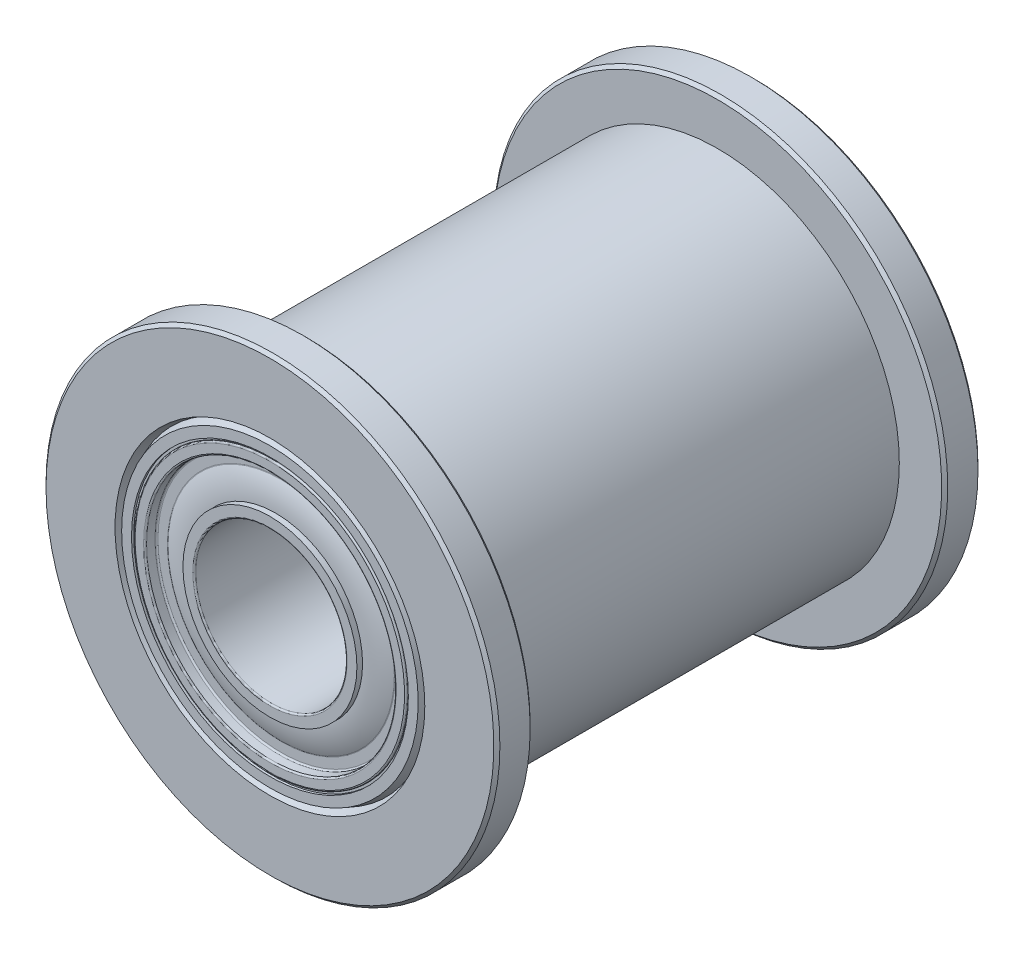
ISO-10303-21;
HEADER;
FILE_DESCRIPTION(('STEP AP214'),'2;1');
FILE_NAME('part.step','',(''),(''),'','','');
FILE_SCHEMA(('AUTOMOTIVE_DESIGN { 1 0 10303 214 1 1 1 1 }'));
ENDSEC;
DATA;
#1=APPLICATION_CONTEXT('core data for automotive mechanical design processes');
#2=APPLICATION_PROTOCOL_DEFINITION('international standard','automotive_design',2000,#1);
#3=PRODUCT_CONTEXT('',#1,'mechanical');
#4=PRODUCT('Part','Part','',(#3));
#5=PRODUCT_RELATED_PRODUCT_CATEGORY('part','',(#4));
#6=PRODUCT_DEFINITION_FORMATION('','',#4);
#7=PRODUCT_DEFINITION_CONTEXT('part definition',#1,'design');
#8=PRODUCT_DEFINITION('design','',#6,#7);
#9=PRODUCT_DEFINITION_SHAPE('','',#8);
#10=(LENGTH_UNIT() NAMED_UNIT(*) SI_UNIT(.MILLI.,.METRE.));
#11=(NAMED_UNIT(*) PLANE_ANGLE_UNIT() SI_UNIT($,.RADIAN.));
#12=(NAMED_UNIT(*) SI_UNIT($,.STERADIAN.) SOLID_ANGLE_UNIT());
#13=UNCERTAINTY_MEASURE_WITH_UNIT(LENGTH_MEASURE(1.E-05),#10,'distance_accuracy_value','');
#14=(GEOMETRIC_REPRESENTATION_CONTEXT(3) GLOBAL_UNCERTAINTY_ASSIGNED_CONTEXT((#13)) GLOBAL_UNIT_ASSIGNED_CONTEXT((#10,
#11,#12)) REPRESENTATION_CONTEXT('',''));
#15=CARTESIAN_POINT('',(0.,0.,0.));
#16=DIRECTION('',(0.,0.,1.));
#17=DIRECTION('',(1.,0.,0.));
#18=AXIS2_PLACEMENT_3D('',#15,#16,#17);
#19=CARTESIAN_POINT('',(0.,7.5,-6.8));
#20=DIRECTION('',(0.,0.,-1.));
#21=DIRECTION('',(-1.,0.,0.));
#22=AXIS2_PLACEMENT_3D('',#19,#20,#21);
#23=PLANE('',#22);
#24=CARTESIAN_POINT('',(0.,0.,-6.8));
#25=DIRECTION('',(0.,0.,-1.));
#26=DIRECTION('',(-1.,0.,0.));
#27=AXIS2_PLACEMENT_3D('',#24,#25,#26);
#28=CIRCLE('',#27,7.39999999999999);
#29=CARTESIAN_POINT('',(-7.39999999999999,0.,-6.8));
#30=VERTEX_POINT('',#29);
#31=EDGE_CURVE('E54',#30,#30,#28,.F.);
#32=ORIENTED_EDGE('',*,*,#31,.T.);
#33=EDGE_LOOP('',(#32));
#34=FACE_BOUND('',#33,.T.);
#35=CARTESIAN_POINT('',(0.,0.,-6.8));
#36=DIRECTION('',(0.,0.,1.));
#37=DIRECTION('',(1.,0.,0.));
#38=AXIS2_PLACEMENT_3D('',#35,#36,#37);
#39=CIRCLE('',#38,6.);
#40=CARTESIAN_POINT('',(6.,0.,-6.8));
#41=VERTEX_POINT('',#40);
#42=EDGE_CURVE('E85',#41,#41,#39,.T.);
#43=ORIENTED_EDGE('',*,*,#42,.F.);
#44=EDGE_LOOP('',(#43));
#45=FACE_BOUND('',#44,.T.);
#46=ADVANCED_FACE('F34',(#34,#45),#23,.F.);
#47=CARTESIAN_POINT('',(0.,0.,8.));
#48=DIRECTION('',(0.,0.,1.));
#49=DIRECTION('',(1.,0.,0.));
#50=AXIS2_PLACEMENT_3D('',#47,#48,#49);
#51=CYLINDRICAL_SURFACE('',#50,7.5);
#52=CARTESIAN_POINT('',(0.,0.,-7.9));
#53=DIRECTION('',(0.,0.,1.));
#54=DIRECTION('',(1.,0.,0.));
#55=AXIS2_PLACEMENT_3D('',#52,#53,#54);
#56=CIRCLE('',#55,7.5);
#57=CARTESIAN_POINT('',(7.5,0.,-7.9));
#58=VERTEX_POINT('',#57);
#59=EDGE_CURVE('E60',#58,#58,#56,.T.);
#60=ORIENTED_EDGE('',*,*,#59,.T.);
#61=EDGE_LOOP('',(#60));
#62=FACE_BOUND('',#61,.T.);
#63=CARTESIAN_POINT('',(0.,0.,-6.90000000000001));
#64=DIRECTION('',(0.,0.,-1.));
#65=DIRECTION('',(-1.,0.,0.));
#66=AXIS2_PLACEMENT_3D('',#63,#64,#65);
#67=CIRCLE('',#66,7.5);
#68=CARTESIAN_POINT('',(-7.5,0.,-6.90000000000001));
#69=VERTEX_POINT('',#68);
#70=EDGE_CURVE('E63',#69,#69,#67,.T.);
#71=ORIENTED_EDGE('',*,*,#70,.T.);
#72=EDGE_LOOP('',(#71));
#73=FACE_BOUND('',#72,.T.);
#74=ADVANCED_FACE('F200',(#62,#73),#51,.T.);
#75=CARTESIAN_POINT('',(0.,7.5,-8.));
#76=DIRECTION('',(0.,0.,1.));
#77=DIRECTION('',(1.,0.,0.));
#78=AXIS2_PLACEMENT_3D('',#75,#76,#77);
#79=PLANE('',#78);
#80=CARTESIAN_POINT('',(0.,0.,-8.));
#81=DIRECTION('',(0.,0.,1.));
#82=DIRECTION('',(1.,0.,0.));
#83=AXIS2_PLACEMENT_3D('',#80,#81,#82);
#84=CIRCLE('',#83,7.40000000000001);
#85=CARTESIAN_POINT('',(7.40000000000001,0.,-8.));
#86=VERTEX_POINT('',#85);
#87=EDGE_CURVE('E57',#86,#86,#84,.F.);
#88=ORIENTED_EDGE('',*,*,#87,.T.);
#89=EDGE_LOOP('',(#88));
#90=FACE_BOUND('',#89,.T.);
#91=CARTESIAN_POINT('',(0.,0.,-8.));
#92=DIRECTION('',(0.,0.,1.));
#93=DIRECTION('',(1.,0.,0.));
#94=AXIS2_PLACEMENT_3D('',#91,#92,#93);
#95=CIRCLE('',#94,5.11838214055972);
#96=CARTESIAN_POINT('',(5.11838214055972,0.,-8.));
#97=VERTEX_POINT('',#96);
#98=EDGE_CURVE('E66',#97,#97,#95,.T.);
#99=ORIENTED_EDGE('',*,*,#98,.T.);
#100=EDGE_LOOP('',(#99));
#101=FACE_BOUND('',#100,.T.);
#102=ADVANCED_FACE('F206',(#90,#101),#79,.F.);
#103=CARTESIAN_POINT('',(0.,0.,-7.7));
#104=DIRECTION('',(0.,0.,-1.));
#105=DIRECTION('',(-1.,0.,0.));
#106=AXIS2_PLACEMENT_3D('',#103,#104,#105);
#107=CONICAL_SURFACE('',#106,5.00919107027986,0.349065850398862);
#108=ORIENTED_EDGE('',*,*,#98,.F.);
#109=EDGE_LOOP('',(#108));
#110=FACE_BOUND('',#109,.T.);
#111=CARTESIAN_POINT('',(0.,0.,-7.7));
#112=DIRECTION('',(0.,0.,1.));
#113=DIRECTION('',(1.,0.,0.));
#114=AXIS2_PLACEMENT_3D('',#111,#112,#113);
#115=CIRCLE('',#114,5.00919107027986);
#116=CARTESIAN_POINT('',(5.00919107027986,0.,-7.7));
#117=VERTEX_POINT('',#116);
#118=EDGE_CURVE('E69',#117,#117,#115,.T.);
#119=ORIENTED_EDGE('',*,*,#118,.T.);
#120=EDGE_LOOP('',(#119));
#121=FACE_BOUND('',#120,.T.);
#122=ADVANCED_FACE('F282',(#110,#121),#107,.F.);
#123=CARTESIAN_POINT('',(0.,0.,-8.));
#124=DIRECTION('',(0.,0.,1.));
#125=DIRECTION('',(1.,0.,0.));
#126=AXIS2_PLACEMENT_3D('',#123,#124,#125);
#127=CONICAL_SURFACE('',#126,4.9,0.349065850398862);
#128=ORIENTED_EDGE('',*,*,#118,.F.);
#129=EDGE_LOOP('',(#128));
#130=FACE_BOUND('',#129,.T.);
#131=CARTESIAN_POINT('',(0.,0.,-8.));
#132=DIRECTION('',(0.,0.,1.));
#133=DIRECTION('',(1.,0.,0.));
#134=AXIS2_PLACEMENT_3D('',#131,#132,#133);
#135=CIRCLE('',#134,4.9);
#136=CARTESIAN_POINT('',(4.9,0.,-8.));
#137=VERTEX_POINT('',#136);
#138=EDGE_CURVE('E72',#137,#137,#135,.T.);
#139=ORIENTED_EDGE('',*,*,#138,.T.);
#140=EDGE_LOOP('',(#139));
#141=FACE_BOUND('',#140,.T.);
#142=ADVANCED_FACE('F278',(#130,#141),#127,.T.);
#143=CARTESIAN_POINT('',(0.,4.9,-8.));
#144=DIRECTION('',(0.,0.,1.));
#145=DIRECTION('',(1.,0.,0.));
#146=AXIS2_PLACEMENT_3D('',#143,#144,#145);
#147=PLANE('',#146);
#148=ORIENTED_EDGE('',*,*,#138,.F.);
#149=EDGE_LOOP('',(#148));
#150=FACE_BOUND('',#149,.T.);
#151=CARTESIAN_POINT('',(0.,0.,-8.));
#152=DIRECTION('',(0.,0.,1.));
#153=DIRECTION('',(1.,0.,0.));
#154=AXIS2_PLACEMENT_3D('',#151,#152,#153);
#155=CIRCLE('',#154,4.575);
#156=CARTESIAN_POINT('',(4.575,0.,-8.));
#157=VERTEX_POINT('',#156);
#158=EDGE_CURVE('E75',#157,#157,#155,.T.);
#159=ORIENTED_EDGE('',*,*,#158,.T.);
#160=EDGE_LOOP('',(#159));
#161=FACE_BOUND('',#160,.T.);
#162=ADVANCED_FACE('F274',(#150,#161),#147,.F.);
#163=CARTESIAN_POINT('',(0.,0.,8.));
#164=DIRECTION('',(0.,0.,1.));
#165=DIRECTION('',(1.,0.,0.));
#166=AXIS2_PLACEMENT_3D('',#163,#164,#165);
#167=CYLINDRICAL_SURFACE('',#166,4.575);
#168=ORIENTED_EDGE('',*,*,#158,.F.);
#169=EDGE_LOOP('',(#168));
#170=FACE_BOUND('',#169,.T.);
#171=CARTESIAN_POINT('',(0.,0.,-7.925));
#172=DIRECTION('',(0.,0.,1.));
#173=DIRECTION('',(1.,0.,0.));
#174=AXIS2_PLACEMENT_3D('',#171,#172,#173);
#175=CIRCLE('',#174,4.575);
#176=CARTESIAN_POINT('',(4.575,0.,-7.925));
#177=VERTEX_POINT('',#176);
#178=EDGE_CURVE('E78',#177,#177,#175,.T.);
#179=ORIENTED_EDGE('',*,*,#178,.T.);
#180=EDGE_LOOP('',(#179));
#181=FACE_BOUND('',#180,.T.);
#182=ADVANCED_FACE('F270',(#170,#181),#167,.F.);
#183=CARTESIAN_POINT('',(0.,4.5,-7.925));
#184=DIRECTION('',(0.,0.,1.));
#185=DIRECTION('',(1.,0.,0.));
#186=AXIS2_PLACEMENT_3D('',#183,#184,#185);
#187=PLANE('',#186);
#188=ORIENTED_EDGE('',*,*,#178,.F.);
#189=EDGE_LOOP('',(#188));
#190=FACE_BOUND('',#189,.T.);
#191=CARTESIAN_POINT('',(0.,0.,-7.925));
#192=DIRECTION('',(0.,0.,1.));
#193=DIRECTION('',(1.,0.,0.));
#194=AXIS2_PLACEMENT_3D('',#191,#192,#193);
#195=CIRCLE('',#194,4.5);
#196=CARTESIAN_POINT('',(4.5,0.,-7.925));
#197=VERTEX_POINT('',#196);
#198=EDGE_CURVE('E82',#197,#197,#195,.T.);
#199=ORIENTED_EDGE('',*,*,#198,.T.);
#200=EDGE_LOOP('',(#199));
#201=FACE_BOUND('',#200,.T.);
#202=ADVANCED_FACE('F266',(#190,#201),#187,.F.);
#203=CARTESIAN_POINT('',(0.,4.5,7.925));
#204=DIRECTION('',(0.,0.,-1.));
#205=DIRECTION('',(-1.,0.,0.));
#206=AXIS2_PLACEMENT_3D('',#203,#204,#205);
#207=PLANE('',#206);
#208=CARTESIAN_POINT('',(0.,0.,7.925));
#209=DIRECTION('',(0.,0.,1.));
#210=DIRECTION('',(1.,0.,0.));
#211=AXIS2_PLACEMENT_3D('',#208,#209,#210);
#212=CIRCLE('',#211,4.5);
#213=CARTESIAN_POINT('',(4.5,0.,7.925));
#214=VERTEX_POINT('',#213);
#215=EDGE_CURVE('E81',#214,#214,#212,.T.);
#216=ORIENTED_EDGE('',*,*,#215,.F.);
#217=EDGE_LOOP('',(#216));
#218=FACE_BOUND('',#217,.T.);
#219=CARTESIAN_POINT('',(0.,0.,7.925));
#220=DIRECTION('',(0.,0.,1.));
#221=DIRECTION('',(1.,0.,0.));
#222=AXIS2_PLACEMENT_3D('',#219,#220,#221);
#223=CIRCLE('',#222,4.575);
#224=CARTESIAN_POINT('',(4.575,0.,7.925));
#225=VERTEX_POINT('',#224);
#226=EDGE_CURVE('E89',#225,#225,#223,.T.);
#227=ORIENTED_EDGE('',*,*,#226,.T.);
#228=EDGE_LOOP('',(#227));
#229=FACE_BOUND('',#228,.T.);
#230=ADVANCED_FACE('F262',(#218,#229),#207,.F.);
#231=CARTESIAN_POINT('',(0.,0.,8.));
#232=DIRECTION('',(0.,0.,1.));
#233=DIRECTION('',(1.,0.,0.));
#234=AXIS2_PLACEMENT_3D('',#231,#232,#233);
#235=CYLINDRICAL_SURFACE('',#234,4.575);
#236=ORIENTED_EDGE('',*,*,#226,.F.);
#237=EDGE_LOOP('',(#236));
#238=FACE_BOUND('',#237,.T.);
#239=CARTESIAN_POINT('',(0.,0.,8.));
#240=DIRECTION('',(0.,0.,1.));
#241=DIRECTION('',(1.,0.,0.));
#242=AXIS2_PLACEMENT_3D('',#239,#240,#241);
#243=CIRCLE('',#242,4.575);
#244=CARTESIAN_POINT('',(4.575,0.,8.));
#245=VERTEX_POINT('',#244);
#246=EDGE_CURVE('E92',#245,#245,#243,.T.);
#247=ORIENTED_EDGE('',*,*,#246,.T.);
#248=EDGE_LOOP('',(#247));
#249=FACE_BOUND('',#248,.T.);
#250=ADVANCED_FACE('F258',(#238,#249),#235,.F.);
#251=CARTESIAN_POINT('',(0.,4.9,8.));
#252=DIRECTION('',(0.,0.,-1.));
#253=DIRECTION('',(-1.,0.,0.));
#254=AXIS2_PLACEMENT_3D('',#251,#252,#253);
#255=PLANE('',#254);
#256=ORIENTED_EDGE('',*,*,#246,.F.);
#257=EDGE_LOOP('',(#256));
#258=FACE_BOUND('',#257,.T.);
#259=CARTESIAN_POINT('',(0.,0.,8.));
#260=DIRECTION('',(0.,0.,1.));
#261=DIRECTION('',(1.,0.,0.));
#262=AXIS2_PLACEMENT_3D('',#259,#260,#261);
#263=CIRCLE('',#262,4.9);
#264=CARTESIAN_POINT('',(4.9,0.,8.));
#265=VERTEX_POINT('',#264);
#266=EDGE_CURVE('E95',#265,#265,#263,.T.);
#267=ORIENTED_EDGE('',*,*,#266,.T.);
#268=EDGE_LOOP('',(#267));
#269=FACE_BOUND('',#268,.T.);
#270=ADVANCED_FACE('F254',(#258,#269),#255,.F.);
#271=CARTESIAN_POINT('',(0.,0.,7.7));
#272=DIRECTION('',(0.,0.,-1.));
#273=DIRECTION('',(-1.,0.,0.));
#274=AXIS2_PLACEMENT_3D('',#271,#272,#273);
#275=CONICAL_SURFACE('',#274,5.00919107027986,0.349065850398864);
#276=ORIENTED_EDGE('',*,*,#266,.F.);
#277=EDGE_LOOP('',(#276));
#278=FACE_BOUND('',#277,.T.);
#279=CARTESIAN_POINT('',(0.,0.,7.7));
#280=DIRECTION('',(0.,0.,1.));
#281=DIRECTION('',(1.,0.,0.));
#282=AXIS2_PLACEMENT_3D('',#279,#280,#281);
#283=CIRCLE('',#282,5.00919107027986);
#284=CARTESIAN_POINT('',(5.00919107027986,0.,7.7));
#285=VERTEX_POINT('',#284);
#286=EDGE_CURVE('E98',#285,#285,#283,.T.);
#287=ORIENTED_EDGE('',*,*,#286,.T.);
#288=EDGE_LOOP('',(#287));
#289=FACE_BOUND('',#288,.T.);
#290=ADVANCED_FACE('F250',(#278,#289),#275,.T.);
#291=CARTESIAN_POINT('',(0.,0.,8.));
#292=DIRECTION('',(0.,0.,1.));
#293=DIRECTION('',(1.,0.,0.));
#294=AXIS2_PLACEMENT_3D('',#291,#292,#293);
#295=CONICAL_SURFACE('',#294,5.11838214055972,0.349065850398864);
#296=ORIENTED_EDGE('',*,*,#286,.F.);
#297=EDGE_LOOP('',(#296));
#298=FACE_BOUND('',#297,.T.);
#299=CARTESIAN_POINT('',(0.,0.,8.));
#300=DIRECTION('',(0.,0.,1.));
#301=DIRECTION('',(1.,0.,0.));
#302=AXIS2_PLACEMENT_3D('',#299,#300,#301);
#303=CIRCLE('',#302,5.11838214055972);
#304=CARTESIAN_POINT('',(5.11838214055972,0.,8.));
#305=VERTEX_POINT('',#304);
#306=EDGE_CURVE('E101',#305,#305,#303,.T.);
#307=ORIENTED_EDGE('',*,*,#306,.T.);
#308=EDGE_LOOP('',(#307));
#309=FACE_BOUND('',#308,.T.);
#310=ADVANCED_FACE('F244',(#298,#309),#295,.F.);
#311=CARTESIAN_POINT('',(0.,7.5,8.));
#312=DIRECTION('',(0.,0.,-1.));
#313=DIRECTION('',(-1.,0.,0.));
#314=AXIS2_PLACEMENT_3D('',#311,#312,#313);
#315=PLANE('',#314);
#316=CARTESIAN_POINT('',(0.,0.,8.));
#317=DIRECTION('',(0.,0.,-1.));
#318=DIRECTION('',(-1.,0.,0.));
#319=AXIS2_PLACEMENT_3D('',#316,#317,#318);
#320=CIRCLE('',#319,7.4);
#321=CARTESIAN_POINT('',(-7.4,0.,8.));
#322=VERTEX_POINT('',#321);
#323=EDGE_CURVE('E10',#322,#322,#320,.F.);
#324=ORIENTED_EDGE('',*,*,#323,.T.);
#325=EDGE_LOOP('',(#324));
#326=FACE_BOUND('',#325,.T.);
#327=ORIENTED_EDGE('',*,*,#306,.F.);
#328=EDGE_LOOP('',(#327));
#329=FACE_BOUND('',#328,.T.);
#330=ADVANCED_FACE('F235',(#326,#329),#315,.F.);
#331=CARTESIAN_POINT('',(0.,0.,8.));
#332=DIRECTION('',(0.,0.,1.));
#333=DIRECTION('',(1.,0.,0.));
#334=AXIS2_PLACEMENT_3D('',#331,#332,#333);
#335=CYLINDRICAL_SURFACE('',#334,7.5);
#336=CARTESIAN_POINT('',(0.,0.,6.9));
#337=DIRECTION('',(0.,0.,1.));
#338=DIRECTION('',(1.,0.,0.));
#339=AXIS2_PLACEMENT_3D('',#336,#337,#338);
#340=CIRCLE('',#339,7.5);
#341=CARTESIAN_POINT('',(7.5,0.,6.9));
#342=VERTEX_POINT('',#341);
#343=EDGE_CURVE('E45',#342,#342,#340,.T.);
#344=ORIENTED_EDGE('',*,*,#343,.T.);
#345=EDGE_LOOP('',(#344));
#346=FACE_BOUND('',#345,.T.);
#347=CARTESIAN_POINT('',(0.,0.,7.9));
#348=DIRECTION('',(0.,0.,-1.));
#349=DIRECTION('',(-1.,0.,0.));
#350=AXIS2_PLACEMENT_3D('',#347,#348,#349);
#351=CIRCLE('',#350,7.5);
#352=CARTESIAN_POINT('',(-7.5,0.,7.9));
#353=VERTEX_POINT('',#352);
#354=EDGE_CURVE('E49',#353,#353,#351,.T.);
#355=ORIENTED_EDGE('',*,*,#354,.T.);
#356=EDGE_LOOP('',(#355));
#357=FACE_BOUND('',#356,.T.);
#358=ADVANCED_FACE('F231',(#346,#357),#335,.T.);
#359=CARTESIAN_POINT('',(0.,7.5,6.8));
#360=DIRECTION('',(0.,0.,1.));
#361=DIRECTION('',(1.,0.,0.));
#362=AXIS2_PLACEMENT_3D('',#359,#360,#361);
#363=PLANE('',#362);
#364=CARTESIAN_POINT('',(0.,0.,6.8));
#365=DIRECTION('',(0.,0.,1.));
#366=DIRECTION('',(1.,0.,0.));
#367=AXIS2_PLACEMENT_3D('',#364,#365,#366);
#368=CIRCLE('',#367,7.4);
#369=CARTESIAN_POINT('',(7.4,0.,6.8));
#370=VERTEX_POINT('',#369);
#371=EDGE_CURVE('E41',#370,#370,#368,.F.);
#372=ORIENTED_EDGE('',*,*,#371,.T.);
#373=EDGE_LOOP('',(#372));
#374=FACE_BOUND('',#373,.T.);
#375=CARTESIAN_POINT('',(0.,0.,6.8));
#376=DIRECTION('',(0.,0.,1.));
#377=DIRECTION('',(1.,0.,0.));
#378=AXIS2_PLACEMENT_3D('',#375,#376,#377);
#379=CIRCLE('',#378,6.);
#380=CARTESIAN_POINT('',(6.,0.,6.8));
#381=VERTEX_POINT('',#380);
#382=EDGE_CURVE('E104',#381,#381,#379,.T.);
#383=ORIENTED_EDGE('',*,*,#382,.T.);
#384=EDGE_LOOP('',(#383));
#385=FACE_BOUND('',#384,.T.);
#386=ADVANCED_FACE('F234',(#374,#385),#363,.F.);
#387=CARTESIAN_POINT('',(0.,0.,8.));
#388=DIRECTION('',(0.,0.,1.));
#389=DIRECTION('',(1.,0.,0.));
#390=AXIS2_PLACEMENT_3D('',#387,#388,#389);
#391=CYLINDRICAL_SURFACE('',#390,6.);
#392=ORIENTED_EDGE('',*,*,#382,.F.);
#393=EDGE_LOOP('',(#392));
#394=FACE_BOUND('',#393,.T.);
#395=ORIENTED_EDGE('',*,*,#42,.T.);
#396=EDGE_LOOP('',(#395));
#397=FACE_BOUND('',#396,.T.);
#398=ADVANCED_FACE('F216',(#394,#397),#391,.T.);
#399=CARTESIAN_POINT('',(0.,0.,-7.9));
#400=DIRECTION('',(0.,0.,1.));
#401=DIRECTION('',(1.,0.,0.));
#402=AXIS2_PLACEMENT_3D('',#399,#400,#401);
#403=CONICAL_SURFACE('',#402,7.5,0.785398163397448);
#404=ORIENTED_EDGE('',*,*,#87,.F.);
#405=EDGE_LOOP('',(#404));
#406=FACE_BOUND('',#405,.T.);
#407=ORIENTED_EDGE('',*,*,#59,.F.);
#408=EDGE_LOOP('',(#407));
#409=FACE_BOUND('',#408,.T.);
#410=ADVANCED_FACE('F212',(#406,#409),#403,.T.);
#411=CARTESIAN_POINT('',(0.,0.,-6.8));
#412=DIRECTION('',(0.,0.,-1.));
#413=DIRECTION('',(-1.,0.,0.));
#414=AXIS2_PLACEMENT_3D('',#411,#412,#413);
#415=CONICAL_SURFACE('',#414,7.39999999999999,0.785398163397448);
#416=CARTESIAN_POINT('',(-7.5,0.,-6.90000000000001));
#417=CARTESIAN_POINT('',(-7.49895833333334,0.,-6.89895833333334));
#418=CARTESIAN_POINT('',(-7.49791666666667,0.,-6.89791666666667));
#419=CARTESIAN_POINT('',(-7.49583333333333,0.,-6.89583333333334));
#420=CARTESIAN_POINT('',(-7.49479166666667,0.,-6.89479166666667));
#421=CARTESIAN_POINT('',(-7.49270833333333,0.,-6.89270833333334));
#422=CARTESIAN_POINT('',(-7.49166666666667,0.,-6.89166666666667));
#423=CARTESIAN_POINT('',(-7.48958333333333,0.,-6.88958333333334));
#424=CARTESIAN_POINT('',(-7.48854166666667,0.,-6.88854166666667));
#425=CARTESIAN_POINT('',(-7.48645833333333,0.,-6.88645833333334));
#426=CARTESIAN_POINT('',(-7.48541666666667,0.,-6.88541666666667));
#427=CARTESIAN_POINT('',(-7.48333333333333,0.,-6.88333333333334));
#428=CARTESIAN_POINT('',(-7.48229166666667,0.,-6.88229166666667));
#429=CARTESIAN_POINT('',(-7.48020833333333,0.,-6.88020833333334));
#430=CARTESIAN_POINT('',(-7.47916666666667,0.,-6.87916666666667));
#431=CARTESIAN_POINT('',(-7.47708333333333,0.,-6.87708333333334));
#432=CARTESIAN_POINT('',(-7.47604166666667,0.,-6.87604166666667));
#433=CARTESIAN_POINT('',(-7.47395833333333,0.,-6.87395833333334));
#434=CARTESIAN_POINT('',(-7.47291666666666,0.,-6.87291666666667));
#435=CARTESIAN_POINT('',(-7.47083333333333,0.,-6.87083333333334));
#436=CARTESIAN_POINT('',(-7.46979166666667,0.,-6.86979166666667));
#437=CARTESIAN_POINT('',(-7.46770833333333,0.,-6.86770833333334));
#438=CARTESIAN_POINT('',(-7.46666666666667,0.,-6.86666666666667));
#439=CARTESIAN_POINT('',(-7.46458333333333,0.,-6.86458333333334));
#440=CARTESIAN_POINT('',(-7.46354166666666,0.,-6.86354166666667));
#441=CARTESIAN_POINT('',(-7.46145833333333,0.,-6.86145833333334));
#442=CARTESIAN_POINT('',(-7.46041666666666,0.,-6.86041666666667));
#443=CARTESIAN_POINT('',(-7.45833333333333,0.,-6.85833333333334));
#444=CARTESIAN_POINT('',(-7.45729166666666,0.,-6.85729166666667));
#445=CARTESIAN_POINT('',(-7.45520833333333,0.,-6.85520833333334));
#446=CARTESIAN_POINT('',(-7.45416666666666,0.,-6.85416666666667));
#447=CARTESIAN_POINT('',(-7.45208333333333,0.,-6.85208333333334));
#448=CARTESIAN_POINT('',(-7.45104166666666,0.,-6.85104166666667));
#449=CARTESIAN_POINT('',(-7.44895833333333,0.,-6.84895833333334));
#450=CARTESIAN_POINT('',(-7.44791666666666,0.,-6.84791666666667));
#451=CARTESIAN_POINT('',(-7.44583333333333,0.,-6.84583333333334));
#452=CARTESIAN_POINT('',(-7.44479166666666,0.,-6.84479166666667));
#453=CARTESIAN_POINT('',(-7.44270833333333,0.,-6.84270833333334));
#454=CARTESIAN_POINT('',(-7.44166666666666,0.,-6.84166666666667));
#455=CARTESIAN_POINT('',(-7.43958333333333,0.,-6.83958333333334));
#456=CARTESIAN_POINT('',(-7.43854166666666,0.,-6.83854166666667));
#457=CARTESIAN_POINT('',(-7.43645833333333,0.,-6.83645833333334));
#458=CARTESIAN_POINT('',(-7.43541666666666,0.,-6.83541666666667));
#459=CARTESIAN_POINT('',(-7.43333333333333,0.,-6.83333333333334));
#460=CARTESIAN_POINT('',(-7.43229166666666,0.,-6.83229166666667));
#461=CARTESIAN_POINT('',(-7.43020833333333,0.,-6.83020833333334));
#462=CARTESIAN_POINT('',(-7.42916666666666,0.,-6.82916666666667));
#463=CARTESIAN_POINT('',(-7.42708333333333,0.,-6.82708333333334));
#464=CARTESIAN_POINT('',(-7.42604166666666,0.,-6.82604166666667));
#465=CARTESIAN_POINT('',(-7.42395833333333,0.,-6.82395833333334));
#466=CARTESIAN_POINT('',(-7.42291666666666,0.,-6.82291666666667));
#467=CARTESIAN_POINT('',(-7.42083333333333,0.,-6.82083333333333));
#468=CARTESIAN_POINT('',(-7.41979166666666,0.,-6.81979166666667));
#469=CARTESIAN_POINT('',(-7.41770833333333,0.,-6.81770833333334));
#470=CARTESIAN_POINT('',(-7.41666666666666,0.,-6.81666666666667));
#471=CARTESIAN_POINT('',(-7.41458333333333,0.,-6.81458333333333));
#472=CARTESIAN_POINT('',(-7.41354166666666,0.,-6.81354166666667));
#473=CARTESIAN_POINT('',(-7.41145833333333,0.,-6.81145833333333));
#474=CARTESIAN_POINT('',(-7.41041666666666,0.,-6.81041666666667));
#475=CARTESIAN_POINT('',(-7.40833333333333,0.,-6.80833333333333));
#476=CARTESIAN_POINT('',(-7.40729166666666,0.,-6.80729166666667));
#477=CARTESIAN_POINT('',(-7.40520833333333,0.,-6.80520833333333));
#478=CARTESIAN_POINT('',(-7.40416666666666,0.,-6.80416666666667));
#479=CARTESIAN_POINT('',(-7.40208333333333,0.,-6.80208333333333));
#480=CARTESIAN_POINT('',(-7.40104166666666,0.,-6.80104166666667));
#481=CARTESIAN_POINT('',(-7.39999999999999,0.,-6.8));
#482=B_SPLINE_CURVE_WITH_KNOTS('',3,(#416,#417,#418,#419,#420,#421,#422,#423,#424,#425,#426,
#427,#428,#429,#430,#431,#432,#433,#434,#435,#436,#437,#438,#439,#440,#441,#442,#443,#444,#445,
#446,#447,#448,#449,#450,#451,#452,#453,#454,#455,#456,#457,#458,#459,#460,#461,#462,#463,#464,
#465,#466,#467,#468,#469,#470,#471,#472,#473,#474,#475,#476,#477,#478,#479,#480,#481),
.UNSPECIFIED.,.F.,.F.,(4,2,2,2,2,2,2,2,2,2,2,2,2,2,2,2,2,2,2,2,2,2,2,2,2,2,2,2,2,2,2,2,4),(0.,
0.00441941738241605,0.00883883476483271,0.0132582521472494,0.0176776695296648,
0.0220970869120815,0.0265165042944981,0.0309359216769136,0.0353553390593302,0.0397747564417469,
0.0441941738241623,0.048613591206579,0.0530330085889956,0.0574524259714111,0.0618718433538277,
0.0662912607362444,0.0707106781186611,0.0751300955010765,0.0795495128834932,0.0839689302659098,
0.0883883476483253,0.0928077650307419,0.0972271824131586,0.101646599795574,0.106066017177991,
0.110485434560407,0.114904851942823,0.119324269325239,0.123743686707656,0.128163104090072,
0.132582521472488,0.137001938854905,0.14142135623732),.UNSPECIFIED.);
#483=EDGE_CURVE('BSEAM215',#69,#30,#482,.T.);
#484=ORIENTED_EDGE('',*,*,#70,.F.);
#485=ORIENTED_EDGE('',*,*,#31,.F.);
#486=ORIENTED_EDGE('',*,*,#483,.T.);
#487=ORIENTED_EDGE('',*,*,#483,.F.);
#488=EDGE_LOOP('',(#484,#486,#485,#487));
#489=FACE_BOUND('',#488,.T.);
#490=ADVANCED_FACE('F215',(#489),#415,.T.);
#491=CARTESIAN_POINT('',(0.,0.,6.9));
#492=DIRECTION('',(0.,0.,1.));
#493=DIRECTION('',(1.,0.,0.));
#494=AXIS2_PLACEMENT_3D('',#491,#492,#493);
#495=CONICAL_SURFACE('',#494,7.5,0.785398163397448);
#496=ORIENTED_EDGE('',*,*,#371,.F.);
#497=EDGE_LOOP('',(#496));
#498=FACE_BOUND('',#497,.T.);
#499=ORIENTED_EDGE('',*,*,#343,.F.);
#500=EDGE_LOOP('',(#499));
#501=FACE_BOUND('',#500,.T.);
#502=ADVANCED_FACE('F219',(#498,#501),#495,.T.);
#503=CARTESIAN_POINT('',(0.,0.,8.));
#504=DIRECTION('',(0.,0.,-1.));
#505=DIRECTION('',(-1.,0.,0.));
#506=AXIS2_PLACEMENT_3D('',#503,#504,#505);
#507=CONICAL_SURFACE('',#506,7.4,0.785398163397461);
#508=ORIENTED_EDGE('',*,*,#354,.F.);
#509=EDGE_LOOP('',(#508));
#510=FACE_BOUND('',#509,.T.);
#511=ORIENTED_EDGE('',*,*,#323,.F.);
#512=EDGE_LOOP('',(#511));
#513=FACE_BOUND('',#512,.T.);
#514=ADVANCED_FACE('F36',(#510,#513),#507,.T.);
#515=CARTESIAN_POINT('',(0.,0.,8.));
#516=DIRECTION('',(0.,0.,1.));
#517=DIRECTION('',(1.,0.,0.));
#518=AXIS2_PLACEMENT_3D('',#515,#516,#517);
#519=CYLINDRICAL_SURFACE('',#518,4.5);
#520=CARTESIAN_POINT('',(0.,0.,7.95));
#521=DIRECTION('',(0.,0.,-1.));
#522=DIRECTION('',(-1.,0.,0.));
#523=AXIS2_PLACEMENT_3D('',#520,#521,#522);
#524=CIRCLE('',#523,4.5);
#525=CARTESIAN_POINT('',(-4.5,0.,7.95));
#526=VERTEX_POINT('',#525);
#527=EDGE_CURVE('E150',#526,#526,#524,.T.);
#528=ORIENTED_EDGE('',*,*,#527,.T.);
#529=EDGE_LOOP('',(#528));
#530=FACE_BOUND('',#529,.T.);
#531=ORIENTED_EDGE('',*,*,#215,.T.);
#532=EDGE_LOOP('',(#531));
#533=FACE_BOUND('',#532,.T.);
#534=ADVANCED_FACE('F226',(#530,#533),#519,.T.);
#535=CARTESIAN_POINT('',(0.,2.5,-8.));
#536=DIRECTION('',(0.,0.,1.));
#537=DIRECTION('',(1.,0.,0.));
#538=AXIS2_PLACEMENT_3D('',#535,#536,#537);
#539=PLANE('',#538);
#540=CARTESIAN_POINT('',(0.,0.,-8.));
#541=DIRECTION('',(0.,0.,1.));
#542=DIRECTION('',(1.,0.,0.));
#543=AXIS2_PLACEMENT_3D('',#540,#541,#542);
#544=CIRCLE('',#543,2.55);
#545=CARTESIAN_POINT('',(2.55,0.,-8.));
#546=VERTEX_POINT('',#545);
#547=EDGE_CURVE('E162',#546,#546,#544,.T.);
#548=ORIENTED_EDGE('',*,*,#547,.T.);
#549=EDGE_LOOP('',(#548));
#550=FACE_BOUND('',#549,.T.);
#551=CARTESIAN_POINT('',(0.,0.,-8.));
#552=DIRECTION('',(0.,0.,1.));
#553=DIRECTION('',(1.,0.,0.));
#554=AXIS2_PLACEMENT_3D('',#551,#552,#553);
#555=CIRCLE('',#554,2.825);
#556=CARTESIAN_POINT('',(2.825,0.,-8.));
#557=VERTEX_POINT('',#556);
#558=EDGE_CURVE('E165',#557,#557,#555,.F.);
#559=ORIENTED_EDGE('',*,*,#558,.T.);
#560=EDGE_LOOP('',(#559));
#561=FACE_BOUND('',#560,.T.);
#562=ADVANCED_FACE('F470',(#550,#561),#539,.F.);
#563=CARTESIAN_POINT('',(0.,0.,8.));
#564=DIRECTION('',(0.,0.,1.));
#565=DIRECTION('',(1.,0.,0.));
#566=AXIS2_PLACEMENT_3D('',#563,#564,#565);
#567=CYLINDRICAL_SURFACE('',#566,2.5);
#568=CARTESIAN_POINT('',(0.,0.,-7.95));
#569=DIRECTION('',(0.,0.,1.));
#570=DIRECTION('',(1.,0.,0.));
#571=AXIS2_PLACEMENT_3D('',#568,#569,#570);
#572=CIRCLE('',#571,2.5);
#573=CARTESIAN_POINT('',(2.5,0.,-7.95));
#574=VERTEX_POINT('',#573);
#575=EDGE_CURVE('E156',#574,#574,#572,.F.);
#576=ORIENTED_EDGE('',*,*,#575,.T.);
#577=EDGE_LOOP('',(#576));
#578=FACE_BOUND('',#577,.T.);
#579=CARTESIAN_POINT('',(0.,0.,7.95));
#580=DIRECTION('',(0.,0.,-1.));
#581=DIRECTION('',(-1.,0.,0.));
#582=AXIS2_PLACEMENT_3D('',#579,#580,#581);
#583=CIRCLE('',#582,2.5);
#584=CARTESIAN_POINT('',(-2.5,0.,7.95));
#585=VERTEX_POINT('',#584);
#586=EDGE_CURVE('E159',#585,#585,#583,.F.);
#587=ORIENTED_EDGE('',*,*,#586,.T.);
#588=EDGE_LOOP('',(#587));
#589=FACE_BOUND('',#588,.T.);
#590=ADVANCED_FACE('F308',(#578,#589),#567,.F.);
#591=ORIENTED_EDGE('',*,*,#198,.F.);
#592=EDGE_LOOP('',(#591));
#593=FACE_BOUND('',#592,.T.);
#594=CARTESIAN_POINT('',(0.,0.,-7.95));
#595=DIRECTION('',(0.,0.,1.));
#596=DIRECTION('',(1.,0.,0.));
#597=AXIS2_PLACEMENT_3D('',#594,#595,#596);
#598=CIRCLE('',#597,4.5);
#599=CARTESIAN_POINT('',(4.5,0.,-7.95));
#600=VERTEX_POINT('',#599);
#601=EDGE_CURVE('E147',#600,#600,#598,.T.);
#602=ORIENTED_EDGE('',*,*,#601,.T.);
#603=EDGE_LOOP('',(#602));
#604=FACE_BOUND('',#603,.T.);
#605=ADVANCED_FACE('F304',(#593,#604),#519,.T.);
#606=CARTESIAN_POINT('',(0.,4.5,-8.));
#607=DIRECTION('',(0.,0.,1.));
#608=DIRECTION('',(1.,0.,0.));
#609=AXIS2_PLACEMENT_3D('',#606,#607,#608);
#610=PLANE('',#609);
#611=CARTESIAN_POINT('',(0.,0.,-8.));
#612=DIRECTION('',(0.,0.,1.));
#613=DIRECTION('',(1.,0.,0.));
#614=AXIS2_PLACEMENT_3D('',#611,#612,#613);
#615=CIRCLE('',#614,4.45);
#616=CARTESIAN_POINT('',(4.45,0.,-8.));
#617=VERTEX_POINT('',#616);
#618=EDGE_CURVE('E141',#617,#617,#615,.F.);
#619=ORIENTED_EDGE('',*,*,#618,.T.);
#620=EDGE_LOOP('',(#619));
#621=FACE_BOUND('',#620,.T.);
#622=CARTESIAN_POINT('',(0.,0.,-8.));
#623=DIRECTION('',(0.,0.,1.));
#624=DIRECTION('',(1.,0.,0.));
#625=AXIS2_PLACEMENT_3D('',#622,#623,#624);
#626=CIRCLE('',#625,4.175);
#627=CARTESIAN_POINT('',(4.175,0.,-8.));
#628=VERTEX_POINT('',#627);
#629=EDGE_CURVE('E144',#628,#628,#626,.T.);
#630=ORIENTED_EDGE('',*,*,#629,.T.);
#631=EDGE_LOOP('',(#630));
#632=FACE_BOUND('',#631,.T.);
#633=ADVANCED_FACE('F307',(#621,#632),#610,.F.);
#634=CARTESIAN_POINT('',(0.,0.,8.));
#635=DIRECTION('',(0.,0.,1.));
#636=DIRECTION('',(1.,0.,0.));
#637=AXIS2_PLACEMENT_3D('',#634,#635,#636);
#638=CYLINDRICAL_SURFACE('',#637,4.125);
#639=CARTESIAN_POINT('',(0.,0.,-7.95));
#640=DIRECTION('',(0.,0.,1.));
#641=DIRECTION('',(1.,0.,0.));
#642=AXIS2_PLACEMENT_3D('',#639,#640,#641);
#643=CIRCLE('',#642,4.125);
#644=CARTESIAN_POINT('',(4.125,0.,-7.95));
#645=VERTEX_POINT('',#644);
#646=EDGE_CURVE('E132',#645,#645,#643,.F.);
#647=ORIENTED_EDGE('',*,*,#646,.T.);
#648=EDGE_LOOP('',(#647));
#649=FACE_BOUND('',#648,.T.);
#650=CARTESIAN_POINT('',(0.,0.,-7.625));
#651=DIRECTION('',(0.,0.,1.));
#652=DIRECTION('',(1.,0.,0.));
#653=AXIS2_PLACEMENT_3D('',#650,#651,#652);
#654=CIRCLE('',#653,4.125);
#655=CARTESIAN_POINT('',(4.125,0.,-7.625));
#656=VERTEX_POINT('',#655);
#657=EDGE_CURVE('E168',#656,#656,#654,.T.);
#658=ORIENTED_EDGE('',*,*,#657,.T.);
#659=EDGE_LOOP('',(#658));
#660=FACE_BOUND('',#659,.T.);
#661=ADVANCED_FACE('F506',(#649,#660),#638,.F.);
#662=CARTESIAN_POINT('',(0.,3.75,-7.625));
#663=DIRECTION('',(0.,0.,1.));
#664=DIRECTION('',(1.,0.,0.));
#665=AXIS2_PLACEMENT_3D('',#662,#663,#664);
#666=PLANE('',#665);
#667=CARTESIAN_POINT('',(0.,0.,-7.625));
#668=DIRECTION('',(0.,0.,1.));
#669=DIRECTION('',(1.,0.,0.));
#670=AXIS2_PLACEMENT_3D('',#667,#668,#669);
#671=CIRCLE('',#670,3.76064947919592);
#672=CARTESIAN_POINT('',(3.76064947919592,0.,-7.625));
#673=VERTEX_POINT('',#672);
#674=EDGE_CURVE('E138',#673,#673,#671,.T.);
#675=ORIENTED_EDGE('',*,*,#674,.T.);
#676=EDGE_LOOP('',(#675));
#677=FACE_BOUND('',#676,.T.);
#678=ORIENTED_EDGE('',*,*,#657,.F.);
#679=EDGE_LOOP('',(#678));
#680=FACE_BOUND('',#679,.T.);
#681=ADVANCED_FACE('F516',(#677,#680),#666,.F.);
#682=CARTESIAN_POINT('',(0.,0.,-5.67708333333334));
#683=DIRECTION('',(0.,0.,1.));
#684=DIRECTION('',(1.,0.,0.));
#685=AXIS2_PLACEMENT_3D('',#682,#683,#684);
#686=TOROIDAL_SURFACE('',#685,2.875,2.13541666666666);
#687=CARTESIAN_POINT('',(0.,0.,-7.62928979980934));
#688=DIRECTION('',(0.,0.,1.));
#689=DIRECTION('',(1.,0.,0.));
#690=AXIS2_PLACEMENT_3D('',#687,#688,#689);
#691=CIRCLE('',#690,3.74038676470526);
#692=CARTESIAN_POINT('',(3.74038676470526,0.,-7.62928979980934));
#693=VERTEX_POINT('',#692);
#694=EDGE_CURVE('E135',#693,#693,#691,.F.);
#695=ORIENTED_EDGE('',*,*,#694,.T.);
#696=EDGE_LOOP('',(#695));
#697=FACE_BOUND('',#696,.T.);
#698=CARTESIAN_POINT('',(0.,0.,-7.8125));
#699=DIRECTION('',(0.,0.,1.));
#700=DIRECTION('',(1.,0.,0.));
#701=AXIS2_PLACEMENT_3D('',#698,#699,#700);
#702=CIRCLE('',#701,2.875);
#703=CARTESIAN_POINT('',(2.875,0.,-7.8125));
#704=VERTEX_POINT('',#703);
#705=EDGE_CURVE('E171',#704,#704,#702,.T.);
#706=ORIENTED_EDGE('',*,*,#705,.T.);
#707=EDGE_LOOP('',(#706));
#708=FACE_BOUND('',#707,.T.);
#709=ADVANCED_FACE('F526',(#697,#708),#686,.T.);
#710=CARTESIAN_POINT('',(0.,0.,8.));
#711=DIRECTION('',(0.,0.,1.));
#712=DIRECTION('',(1.,0.,0.));
#713=AXIS2_PLACEMENT_3D('',#710,#711,#712);
#714=CYLINDRICAL_SURFACE('',#713,2.875);
#715=CARTESIAN_POINT('',(0.,0.,-7.95));
#716=DIRECTION('',(0.,0.,1.));
#717=DIRECTION('',(1.,0.,0.));
#718=AXIS2_PLACEMENT_3D('',#715,#716,#717);
#719=CIRCLE('',#718,2.875);
#720=CARTESIAN_POINT('',(2.875,0.,-7.95));
#721=VERTEX_POINT('',#720);
#722=EDGE_CURVE('E153',#721,#721,#719,.T.);
#723=ORIENTED_EDGE('',*,*,#722,.T.);
#724=EDGE_LOOP('',(#723));
#725=FACE_BOUND('',#724,.T.);
#726=ORIENTED_EDGE('',*,*,#705,.F.);
#727=EDGE_LOOP('',(#726));
#728=FACE_BOUND('',#727,.T.);
#729=ADVANCED_FACE('F536',(#725,#728),#714,.T.);
#730=CARTESIAN_POINT('',(0.,2.5,8.));
#731=DIRECTION('',(0.,0.,-1.));
#732=DIRECTION('',(1.,0.,0.));
#733=AXIS2_PLACEMENT_3D('',#730,#731,#732);
#734=PLANE('',#733);
#735=CARTESIAN_POINT('',(0.,0.,8.));
#736=DIRECTION('',(0.,0.,-1.));
#737=DIRECTION('',(-1.,0.,0.));
#738=AXIS2_PLACEMENT_3D('',#735,#736,#737);
#739=CIRCLE('',#738,2.55);
#740=CARTESIAN_POINT('',(-2.55,0.,8.));
#741=VERTEX_POINT('',#740);
#742=EDGE_CURVE('E86',#741,#741,#739,.T.);
#743=ORIENTED_EDGE('',*,*,#742,.T.);
#744=EDGE_LOOP('',(#743));
#745=FACE_BOUND('',#744,.T.);
#746=CARTESIAN_POINT('',(0.,0.,8.));
#747=DIRECTION('',(0.,0.,1.));
#748=DIRECTION('',(1.,0.,0.));
#749=AXIS2_PLACEMENT_3D('',#746,#747,#748);
#750=CIRCLE('',#749,2.875);
#751=CARTESIAN_POINT('',(2.875,0.,8.));
#752=VERTEX_POINT('',#751);
#753=EDGE_CURVE('E177',#752,#752,#750,.T.);
#754=ORIENTED_EDGE('',*,*,#753,.T.);
#755=EDGE_LOOP('',(#754));
#756=FACE_BOUND('',#755,.T.);
#757=ADVANCED_FACE('F181',(#745,#756),#734,.F.);
#758=CARTESIAN_POINT('',(0.,4.5,8.));
#759=DIRECTION('',(0.,0.,-1.));
#760=DIRECTION('',(1.,0.,0.));
#761=AXIS2_PLACEMENT_3D('',#758,#759,#760);
#762=PLANE('',#761);
#763=CARTESIAN_POINT('',(0.,0.,8.));
#764=DIRECTION('',(0.,0.,-1.));
#765=DIRECTION('',(-1.,0.,0.));
#766=AXIS2_PLACEMENT_3D('',#763,#764,#765);
#767=CIRCLE('',#766,4.45);
#768=CARTESIAN_POINT('',(-4.45,0.,8.));
#769=VERTEX_POINT('',#768);
#770=EDGE_CURVE('E111',#769,#769,#767,.F.);
#771=ORIENTED_EDGE('',*,*,#770,.T.);
#772=EDGE_LOOP('',(#771));
#773=FACE_BOUND('',#772,.T.);
#774=CARTESIAN_POINT('',(0.,0.,8.));
#775=DIRECTION('',(0.,0.,-1.));
#776=DIRECTION('',(-1.,0.,0.));
#777=AXIS2_PLACEMENT_3D('',#774,#775,#776);
#778=CIRCLE('',#777,4.175);
#779=CARTESIAN_POINT('',(-4.175,0.,8.));
#780=VERTEX_POINT('',#779);
#781=EDGE_CURVE('E114',#780,#780,#778,.T.);
#782=ORIENTED_EDGE('',*,*,#781,.T.);
#783=EDGE_LOOP('',(#782));
#784=FACE_BOUND('',#783,.T.);
#785=ADVANCED_FACE('F555',(#773,#784),#762,.F.);
#786=CARTESIAN_POINT('',(0.,0.,-8.));
#787=DIRECTION('',(0.,0.,-1.));
#788=DIRECTION('',(1.,0.,0.));
#789=AXIS2_PLACEMENT_3D('',#786,#787,#788);
#790=CYLINDRICAL_SURFACE('',#789,4.125);
#791=CARTESIAN_POINT('',(0.,0.,7.675));
#792=DIRECTION('',(0.,0.,-1.));
#793=DIRECTION('',(-1.,0.,0.));
#794=AXIS2_PLACEMENT_3D('',#791,#792,#793);
#795=CIRCLE('',#794,4.125);
#796=CARTESIAN_POINT('',(-4.125,0.,7.675));
#797=VERTEX_POINT('',#796);
#798=EDGE_CURVE('E117',#797,#797,#795,.T.);
#799=ORIENTED_EDGE('',*,*,#798,.T.);
#800=EDGE_LOOP('',(#799));
#801=FACE_BOUND('',#800,.T.);
#802=CARTESIAN_POINT('',(0.,0.,7.95));
#803=DIRECTION('',(0.,0.,-1.));
#804=DIRECTION('',(-1.,0.,0.));
#805=AXIS2_PLACEMENT_3D('',#802,#803,#804);
#806=CIRCLE('',#805,4.125);
#807=CARTESIAN_POINT('',(-4.125,0.,7.95));
#808=VERTEX_POINT('',#807);
#809=EDGE_CURVE('E120',#808,#808,#806,.F.);
#810=ORIENTED_EDGE('',*,*,#809,.T.);
#811=EDGE_LOOP('',(#810));
#812=FACE_BOUND('',#811,.T.);
#813=ADVANCED_FACE('F565',(#801,#812),#790,.F.);
#814=CARTESIAN_POINT('',(0.,3.75,7.625));
#815=DIRECTION('',(0.,0.,-1.));
#816=DIRECTION('',(1.,0.,0.));
#817=AXIS2_PLACEMENT_3D('',#814,#815,#816);
#818=PLANE('',#817);
#819=CARTESIAN_POINT('',(0.,0.,7.625));
#820=DIRECTION('',(0.,0.,-1.));
#821=DIRECTION('',(-1.,0.,0.));
#822=AXIS2_PLACEMENT_3D('',#819,#820,#821);
#823=CIRCLE('',#822,3.76064947919592);
#824=CARTESIAN_POINT('',(-3.76064947919592,0.,7.625));
#825=VERTEX_POINT('',#824);
#826=EDGE_CURVE('E123',#825,#825,#823,.T.);
#827=ORIENTED_EDGE('',*,*,#826,.T.);
#828=EDGE_LOOP('',(#827));
#829=FACE_BOUND('',#828,.T.);
#830=CARTESIAN_POINT('',(0.,0.,7.625));
#831=DIRECTION('',(0.,0.,-1.));
#832=DIRECTION('',(-1.,0.,0.));
#833=AXIS2_PLACEMENT_3D('',#830,#831,#832);
#834=CIRCLE('',#833,4.075);
#835=CARTESIAN_POINT('',(-4.075,0.,7.625));
#836=VERTEX_POINT('',#835);
#837=EDGE_CURVE('E126',#836,#836,#834,.F.);
#838=ORIENTED_EDGE('',*,*,#837,.T.);
#839=EDGE_LOOP('',(#838));
#840=FACE_BOUND('',#839,.T.);
#841=ADVANCED_FACE('F196',(#829,#840),#818,.F.);
#842=CARTESIAN_POINT('',(0.,0.,5.67708333333334));
#843=DIRECTION('',(0.,0.,-1.));
#844=DIRECTION('',(1.,0.,0.));
#845=AXIS2_PLACEMENT_3D('',#842,#843,#844);
#846=TOROIDAL_SURFACE('',#845,2.875,2.13541666666666);
#847=CARTESIAN_POINT('',(0.,0.,7.62928979980934));
#848=DIRECTION('',(0.,0.,-1.));
#849=DIRECTION('',(-1.,0.,0.));
#850=AXIS2_PLACEMENT_3D('',#847,#848,#849);
#851=CIRCLE('',#850,3.74038676470526);
#852=CARTESIAN_POINT('',(-3.74038676470526,0.,7.62928979980934));
#853=VERTEX_POINT('',#852);
#854=EDGE_CURVE('E129',#853,#853,#851,.F.);
#855=ORIENTED_EDGE('',*,*,#854,.T.);
#856=EDGE_LOOP('',(#855));
#857=FACE_BOUND('',#856,.T.);
#858=CARTESIAN_POINT('',(0.,0.,7.8125));
#859=DIRECTION('',(0.,0.,1.));
#860=DIRECTION('',(1.,0.,0.));
#861=AXIS2_PLACEMENT_3D('',#858,#859,#860);
#862=CIRCLE('',#861,2.875);
#863=CARTESIAN_POINT('',(2.875,0.,7.8125));
#864=VERTEX_POINT('',#863);
#865=EDGE_CURVE('E174',#864,#864,#862,.T.);
#866=ORIENTED_EDGE('',*,*,#865,.F.);
#867=EDGE_LOOP('',(#866));
#868=FACE_BOUND('',#867,.T.);
#869=ADVANCED_FACE('F186',(#857,#868),#846,.T.);
#870=CARTESIAN_POINT('',(0.,0.,-8.));
#871=DIRECTION('',(0.,0.,-1.));
#872=DIRECTION('',(1.,0.,0.));
#873=AXIS2_PLACEMENT_3D('',#870,#871,#872);
#874=CYLINDRICAL_SURFACE('',#873,2.875);
#875=ORIENTED_EDGE('',*,*,#865,.T.);
#876=EDGE_LOOP('',(#875));
#877=FACE_BOUND('',#876,.T.);
#878=ORIENTED_EDGE('',*,*,#753,.F.);
#879=EDGE_LOOP('',(#878));
#880=FACE_BOUND('',#879,.T.);
#881=ADVANCED_FACE('F183',(#877,#880),#874,.T.);
#882=CARTESIAN_POINT('',(0.,0.,-7.95));
#883=DIRECTION('',(0.,0.,1.));
#884=DIRECTION('',(1.,0.,0.));
#885=AXIS2_PLACEMENT_3D('',#882,#883,#884);
#886=TOROIDAL_SURFACE('',#885,2.55,0.05);
#887=ORIENTED_EDGE('',*,*,#575,.F.);
#888=EDGE_LOOP('',(#887));
#889=FACE_BOUND('',#888,.T.);
#890=ORIENTED_EDGE('',*,*,#547,.F.);
#891=EDGE_LOOP('',(#890));
#892=FACE_BOUND('',#891,.T.);
#893=ADVANCED_FACE('F185',(#889,#892),#886,.T.);
#894=CARTESIAN_POINT('',(0.,0.,-7.95));
#895=DIRECTION('',(0.,0.,1.));
#896=DIRECTION('',(1.,0.,0.));
#897=AXIS2_PLACEMENT_3D('',#894,#895,#896);
#898=TOROIDAL_SURFACE('',#897,2.825,0.05);
#899=ORIENTED_EDGE('',*,*,#558,.F.);
#900=EDGE_LOOP('',(#899));
#901=FACE_BOUND('',#900,.T.);
#902=ORIENTED_EDGE('',*,*,#722,.F.);
#903=EDGE_LOOP('',(#902));
#904=FACE_BOUND('',#903,.T.);
#905=ADVANCED_FACE('F193',(#901,#904),#898,.T.);
#906=CARTESIAN_POINT('',(0.,0.,-7.95));
#907=DIRECTION('',(0.,0.,1.));
#908=DIRECTION('',(1.,0.,0.));
#909=AXIS2_PLACEMENT_3D('',#906,#907,#908);
#910=TOROIDAL_SURFACE('',#909,4.45,0.05);
#911=ORIENTED_EDGE('',*,*,#618,.F.);
#912=EDGE_LOOP('',(#911));
#913=FACE_BOUND('',#912,.T.);
#914=ORIENTED_EDGE('',*,*,#601,.F.);
#915=EDGE_LOOP('',(#914));
#916=FACE_BOUND('',#915,.T.);
#917=ADVANCED_FACE('F312',(#913,#916),#910,.T.);
#918=CARTESIAN_POINT('',(0.,0.,-7.675));
#919=DIRECTION('',(0.,0.,1.));
#920=DIRECTION('',(1.,0.,0.));
#921=AXIS2_PLACEMENT_3D('',#918,#919,#920);
#922=TOROIDAL_SURFACE('',#921,3.76064947919592,0.05);
#923=ORIENTED_EDGE('',*,*,#694,.F.);
#924=EDGE_LOOP('',(#923));
#925=FACE_BOUND('',#924,.T.);
#926=ORIENTED_EDGE('',*,*,#674,.F.);
#927=EDGE_LOOP('',(#926));
#928=FACE_BOUND('',#927,.T.);
#929=ADVANCED_FACE('F314',(#925,#928),#922,.F.);
#930=CARTESIAN_POINT('',(0.,0.,-7.95));
#931=DIRECTION('',(0.,0.,1.));
#932=DIRECTION('',(1.,0.,0.));
#933=AXIS2_PLACEMENT_3D('',#930,#931,#932);
#934=TOROIDAL_SURFACE('',#933,4.175,0.05);
#935=ORIENTED_EDGE('',*,*,#646,.F.);
#936=EDGE_LOOP('',(#935));
#937=FACE_BOUND('',#936,.T.);
#938=ORIENTED_EDGE('',*,*,#629,.F.);
#939=EDGE_LOOP('',(#938));
#940=FACE_BOUND('',#939,.T.);
#941=ADVANCED_FACE('F321',(#937,#940),#934,.T.);
#942=CARTESIAN_POINT('',(0.,0.,7.675));
#943=DIRECTION('',(0.,0.,-1.));
#944=DIRECTION('',(-1.,0.,0.));
#945=AXIS2_PLACEMENT_3D('',#942,#943,#944);
#946=TOROIDAL_SURFACE('',#945,3.76064947919592,0.05);
#947=ORIENTED_EDGE('',*,*,#826,.F.);
#948=EDGE_LOOP('',(#947));
#949=FACE_BOUND('',#948,.T.);
#950=ORIENTED_EDGE('',*,*,#854,.F.);
#951=EDGE_LOOP('',(#950));
#952=FACE_BOUND('',#951,.T.);
#953=ADVANCED_FACE('F330',(#949,#952),#946,.F.);
#954=CARTESIAN_POINT('',(0.,0.,7.675));
#955=DIRECTION('',(0.,0.,-1.));
#956=DIRECTION('',(-1.,0.,0.));
#957=AXIS2_PLACEMENT_3D('',#954,#955,#956);
#958=TOROIDAL_SURFACE('',#957,4.075,0.05);
#959=ORIENTED_EDGE('',*,*,#798,.F.);
#960=EDGE_LOOP('',(#959));
#961=FACE_BOUND('',#960,.T.);
#962=ORIENTED_EDGE('',*,*,#837,.F.);
#963=EDGE_LOOP('',(#962));
#964=FACE_BOUND('',#963,.T.);
#965=ADVANCED_FACE('F334',(#961,#964),#958,.F.);
#966=CARTESIAN_POINT('',(0.,0.,7.95));
#967=DIRECTION('',(0.,0.,-1.));
#968=DIRECTION('',(-1.,0.,0.));
#969=AXIS2_PLACEMENT_3D('',#966,#967,#968);
#970=TOROIDAL_SURFACE('',#969,4.45,0.05);
#971=ORIENTED_EDGE('',*,*,#527,.F.);
#972=EDGE_LOOP('',(#971));
#973=FACE_BOUND('',#972,.T.);
#974=ORIENTED_EDGE('',*,*,#770,.F.);
#975=EDGE_LOOP('',(#974));
#976=FACE_BOUND('',#975,.T.);
#977=ADVANCED_FACE('F338',(#973,#976),#970,.T.);
#978=CARTESIAN_POINT('',(0.,0.,7.95));
#979=DIRECTION('',(0.,0.,-1.));
#980=DIRECTION('',(-1.,0.,0.));
#981=AXIS2_PLACEMENT_3D('',#978,#979,#980);
#982=TOROIDAL_SURFACE('',#981,4.175,0.05);
#983=ORIENTED_EDGE('',*,*,#781,.F.);
#984=EDGE_LOOP('',(#983));
#985=FACE_BOUND('',#984,.T.);
#986=ORIENTED_EDGE('',*,*,#809,.F.);
#987=EDGE_LOOP('',(#986));
#988=FACE_BOUND('',#987,.T.);
#989=ADVANCED_FACE('F342',(#985,#988),#982,.T.);
#990=CARTESIAN_POINT('',(0.,0.,7.95));
#991=DIRECTION('',(0.,0.,-1.));
#992=DIRECTION('',(-1.,0.,0.));
#993=AXIS2_PLACEMENT_3D('',#990,#991,#992);
#994=TOROIDAL_SURFACE('',#993,2.55,0.05);
#995=ORIENTED_EDGE('',*,*,#742,.F.);
#996=EDGE_LOOP('',(#995));
#997=FACE_BOUND('',#996,.T.);
#998=ORIENTED_EDGE('',*,*,#586,.F.);
#999=EDGE_LOOP('',(#998));
#1000=FACE_BOUND('',#999,.T.);
#1001=ADVANCED_FACE('F346',(#997,#1000),#994,.T.);
#1002=CLOSED_SHELL('',(#46,#74,#102,#122,#142,#162,#182,#202,#230,#250,#270,#290,#310,#330,#358,
#386,#398,#410,#490,#502,#514,#534,#562,#590,#605,#633,#661,#681,#709,#729,#757,#785,#813,#841,
#869,#881,#893,#905,#917,#929,#941,#953,#965,#977,#989,#1001));
#1003=MANIFOLD_SOLID_BREP('B2',#1002);
#1004=ADVANCED_BREP_SHAPE_REPRESENTATION('',(#18,#1003),#14);
#1005=SHAPE_DEFINITION_REPRESENTATION(#9,#1004);
ENDSEC;
END-ISO-10303-21;
